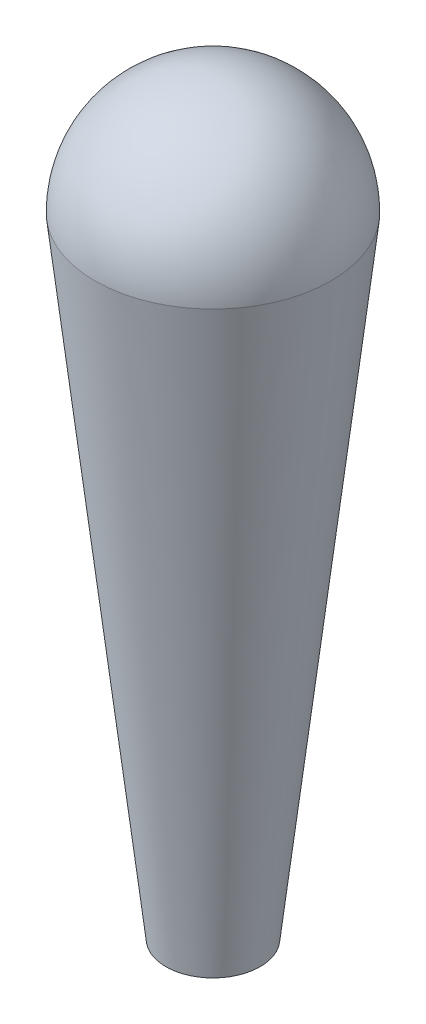
ISO-10303-21;
HEADER;
FILE_DESCRIPTION(('STEP AP214'),'2;1');
FILE_NAME('part.step','',(''),(''),'','','');
FILE_SCHEMA(('AUTOMOTIVE_DESIGN { 1 0 10303 214 1 1 1 1 }'));
ENDSEC;
DATA;
#1=APPLICATION_CONTEXT('core data for automotive mechanical design processes');
#2=APPLICATION_PROTOCOL_DEFINITION('international standard','automotive_design',2000,#1);
#3=PRODUCT_CONTEXT('',#1,'mechanical');
#4=PRODUCT('Part','Part','',(#3));
#5=PRODUCT_RELATED_PRODUCT_CATEGORY('part','',(#4));
#6=PRODUCT_DEFINITION_FORMATION('','',#4);
#7=PRODUCT_DEFINITION_CONTEXT('part definition',#1,'design');
#8=PRODUCT_DEFINITION('design','',#6,#7);
#9=PRODUCT_DEFINITION_SHAPE('','',#8);
#10=(LENGTH_UNIT() NAMED_UNIT(*) SI_UNIT(.MILLI.,.METRE.));
#11=(NAMED_UNIT(*) PLANE_ANGLE_UNIT() SI_UNIT($,.RADIAN.));
#12=(NAMED_UNIT(*) SI_UNIT($,.STERADIAN.) SOLID_ANGLE_UNIT());
#13=UNCERTAINTY_MEASURE_WITH_UNIT(LENGTH_MEASURE(1.E-05),#10,'distance_accuracy_value','');
#14=(GEOMETRIC_REPRESENTATION_CONTEXT(3) GLOBAL_UNCERTAINTY_ASSIGNED_CONTEXT((#13)) GLOBAL_UNIT_ASSIGNED_CONTEXT((#10,
#11,#12)) REPRESENTATION_CONTEXT('',''));
#15=CARTESIAN_POINT('',(0.,0.,0.));
#16=DIRECTION('',(0.,0.,1.));
#17=DIRECTION('',(1.,0.,0.));
#18=AXIS2_PLACEMENT_3D('',#15,#16,#17);
#19=CARTESIAN_POINT('',(7.62,0.,0.));
#20=DIRECTION('',(0.,-1.,0.));
#21=DIRECTION('',(0.,0.,-1.));
#22=AXIS2_PLACEMENT_3D('',#19,#20,#21);
#23=PLANE('',#22);
#24=CARTESIAN_POINT('',(0.,0.,0.));
#25=DIRECTION('',(0.,-1.,0.));
#26=DIRECTION('',(0.,0.,-1.));
#27=AXIS2_PLACEMENT_3D('',#24,#25,#26);
#28=CIRCLE('',#27,7.62);
#29=CARTESIAN_POINT('',(0.,0.,-7.62));
#30=VERTEX_POINT('',#29);
#31=EDGE_CURVE('E38',#30,#30,#28,.T.);
#32=ORIENTED_EDGE('',*,*,#31,.T.);
#33=EDGE_LOOP('',(#32));
#34=FACE_BOUND('',#33,.T.);
#35=ADVANCED_FACE('F31',(#34),#23,.T.);
#36=CARTESIAN_POINT('',(0.,101.6,0.));
#37=DIRECTION('',(0.,0.,1.));
#38=DIRECTION('',(1.,0.,0.));
#39=AXIS2_PLACEMENT_3D('',#36,#37,#38);
#40=SPHERICAL_SURFACE('',#39,19.05);
#41=CARTESIAN_POINT('',(0.,101.6,0.));
#42=DIRECTION('',(0.,-1.,0.));
#43=DIRECTION('',(0.,0.,-1.));
#44=AXIS2_PLACEMENT_3D('',#41,#42,#43);
#45=SPHERICAL_SURFACE('',#44,19.05);
#46=CARTESIAN_POINT('',(0.,101.6,0.));
#47=DIRECTION('',(0.,-1.,0.));
#48=DIRECTION('',(0.,0.,-1.));
#49=AXIS2_PLACEMENT_3D('',#46,#47,#48);
#50=CIRCLE('',#49,19.05);
#51=CARTESIAN_POINT('',(0.,101.6,-19.05));
#52=VERTEX_POINT('',#51);
#53=EDGE_CURVE('E10',#52,#52,#50,.T.);
#54=ORIENTED_EDGE('',*,*,#53,.F.);
#55=EDGE_LOOP('',(#54));
#56=FACE_BOUND('',#55,.T.);
#57=ADVANCED_FACE('F33',(#56),#45,.T.);
#58=CARTESIAN_POINT('',(0.,0.,0.));
#59=DIRECTION('',(0.,1.,0.));
#60=DIRECTION('',(0.,0.,1.));
#61=AXIS2_PLACEMENT_3D('',#58,#59,#60);
#62=CONICAL_SURFACE('',#61,7.62,0.112028962425988);
#63=ORIENTED_EDGE('',*,*,#53,.T.);
#64=EDGE_LOOP('',(#63));
#65=FACE_BOUND('',#64,.T.);
#66=ORIENTED_EDGE('',*,*,#31,.F.);
#67=EDGE_LOOP('',(#66));
#68=FACE_BOUND('',#67,.T.);
#69=ADVANCED_FACE('F45',(#65,#68),#62,.T.);
#70=CLOSED_SHELL('',(#35,#57,#69));
#71=MANIFOLD_SOLID_BREP('B2',#70);
#72=ADVANCED_BREP_SHAPE_REPRESENTATION('',(#18,#71),#14);
#73=SHAPE_DEFINITION_REPRESENTATION(#9,#72);
ENDSEC;
END-ISO-10303-21;
